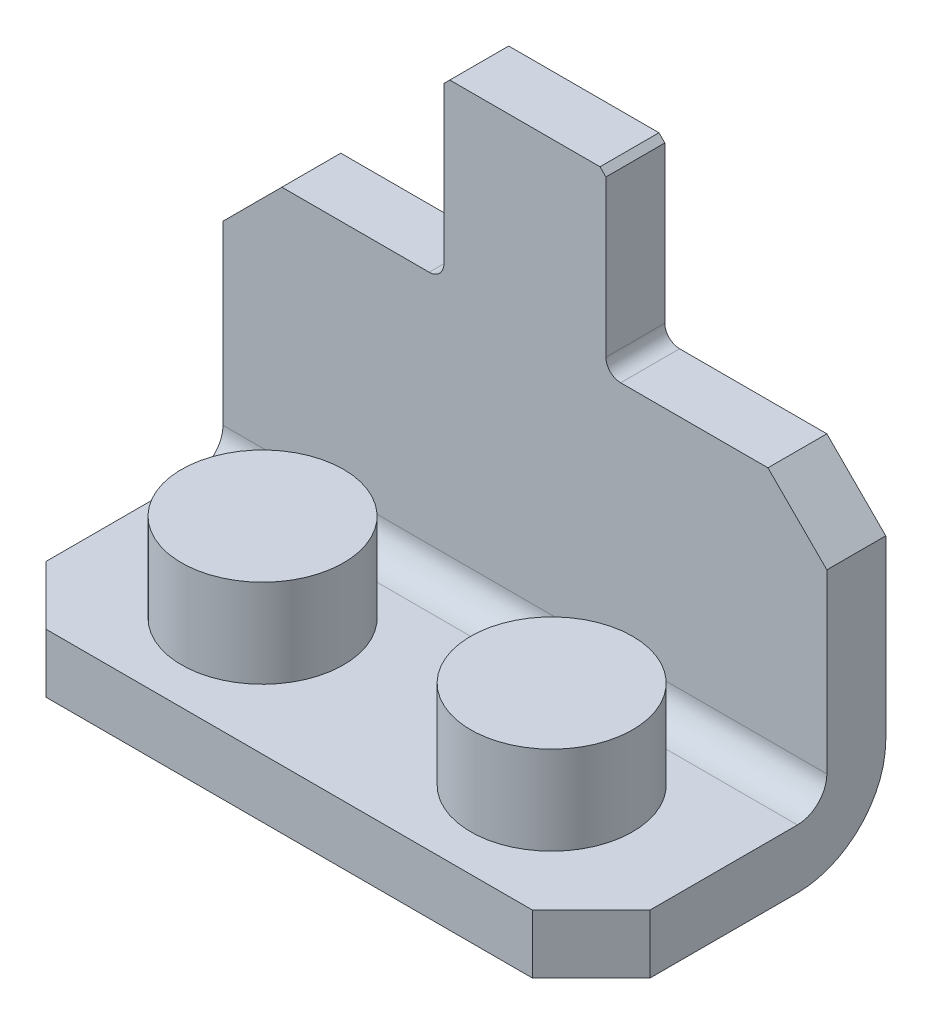
ISO-10303-21;
HEADER;
FILE_DESCRIPTION(('STEP AP214'),'2;1');
FILE_NAME('part.step','',(''),(''),'','','');
FILE_SCHEMA(('AUTOMOTIVE_DESIGN { 1 0 10303 214 1 1 1 1 }'));
ENDSEC;
DATA;
#1=APPLICATION_CONTEXT('core data for automotive mechanical design processes');
#2=APPLICATION_PROTOCOL_DEFINITION('international standard','automotive_design',2000,#1);
#3=PRODUCT_CONTEXT('',#1,'mechanical');
#4=PRODUCT('Part','Part','',(#3));
#5=PRODUCT_RELATED_PRODUCT_CATEGORY('part','',(#4));
#6=PRODUCT_DEFINITION_FORMATION('','',#4);
#7=PRODUCT_DEFINITION_CONTEXT('part definition',#1,'design');
#8=PRODUCT_DEFINITION('design','',#6,#7);
#9=PRODUCT_DEFINITION_SHAPE('','',#8);
#10=(LENGTH_UNIT() NAMED_UNIT(*) SI_UNIT(.MILLI.,.METRE.));
#11=(NAMED_UNIT(*) PLANE_ANGLE_UNIT() SI_UNIT($,.RADIAN.));
#12=(NAMED_UNIT(*) SI_UNIT($,.STERADIAN.) SOLID_ANGLE_UNIT());
#13=UNCERTAINTY_MEASURE_WITH_UNIT(LENGTH_MEASURE(1.E-05),#10,'distance_accuracy_value','');
#14=(GEOMETRIC_REPRESENTATION_CONTEXT(3) GLOBAL_UNCERTAINTY_ASSIGNED_CONTEXT((#13)) GLOBAL_UNIT_ASSIGNED_CONTEXT((#10,
#11,#12)) REPRESENTATION_CONTEXT('',''));
#15=CARTESIAN_POINT('',(0.,0.,0.));
#16=DIRECTION('',(0.,0.,1.));
#17=DIRECTION('',(1.,0.,0.));
#18=AXIS2_PLACEMENT_3D('',#15,#16,#17);
#19=CARTESIAN_POINT('',(4.90718107860033,2.,3.));
#20=DIRECTION('',(0.,1.,0.));
#21=DIRECTION('',(0.,0.,1.));
#22=AXIS2_PLACEMENT_3D('',#19,#20,#21);
#23=PLANE('',#22);
#24=CARTESIAN_POINT('',(4.90718107860033,2.,3.));
#25=DIRECTION('',(0.,1.,0.));
#26=DIRECTION('',(0.,0.,1.));
#27=AXIS2_PLACEMENT_3D('',#24,#25,#26);
#28=CIRCLE('',#27,1.65);
#29=CARTESIAN_POINT('',(4.90718107860033,2.,4.65));
#30=VERTEX_POINT('',#29);
#31=EDGE_CURVE('E20',#30,#30,#28,.F.);
#32=ORIENTED_EDGE('',*,*,#31,.T.);
#33=EDGE_LOOP('',(#32));
#34=FACE_BOUND('',#33,.T.);
#35=ADVANCED_FACE('F17',(#34),#23,.F.);
#36=CARTESIAN_POINT('',(-4.9071810785995,2.,3.));
#37=DIRECTION('',(0.,1.,0.));
#38=DIRECTION('',(0.,0.,1.));
#39=AXIS2_PLACEMENT_3D('',#36,#37,#38);
#40=PLANE('',#39);
#41=CARTESIAN_POINT('',(-4.9071810785995,2.,3.));
#42=DIRECTION('',(0.,1.,0.));
#43=DIRECTION('',(0.,0.,1.));
#44=AXIS2_PLACEMENT_3D('',#41,#42,#43);
#45=CIRCLE('',#44,1.65);
#46=CARTESIAN_POINT('',(-4.9071810785995,2.,4.65));
#47=VERTEX_POINT('',#46);
#48=EDGE_CURVE('E397',#47,#47,#45,.F.);
#49=ORIENTED_EDGE('',*,*,#48,.T.);
#50=EDGE_LOOP('',(#49));
#51=FACE_BOUND('',#50,.T.);
#52=ADVANCED_FACE('F408',(#51),#40,.F.);
#53=CARTESIAN_POINT('',(4.90718107860033,0.,3.));
#54=DIRECTION('',(0.,1.,0.));
#55=DIRECTION('',(0.,0.,1.));
#56=AXIS2_PLACEMENT_3D('',#53,#54,#55);
#57=CYLINDRICAL_SURFACE('',#56,1.65);
#58=CARTESIAN_POINT('',(4.90718107860033,0.,3.));
#59=DIRECTION('',(0.,1.,0.));
#60=DIRECTION('',(0.,0.,1.));
#61=AXIS2_PLACEMENT_3D('',#58,#59,#60);
#62=CIRCLE('',#61,1.65);
#63=CARTESIAN_POINT('',(4.90718107860033,0.,4.65));
#64=VERTEX_POINT('',#63);
#65=EDGE_CURVE('E395',#64,#64,#62,.F.);
#66=ORIENTED_EDGE('',*,*,#65,.T.);
#67=EDGE_LOOP('',(#66));
#68=FACE_BOUND('',#67,.T.);
#69=ORIENTED_EDGE('',*,*,#31,.F.);
#70=EDGE_LOOP('',(#69));
#71=FACE_BOUND('',#70,.T.);
#72=ADVANCED_FACE('F405',(#68,#71),#57,.F.);
#73=CARTESIAN_POINT('',(-4.9071810785995,0.,3.));
#74=DIRECTION('',(0.,1.,0.));
#75=DIRECTION('',(0.,0.,1.));
#76=AXIS2_PLACEMENT_3D('',#73,#74,#75);
#77=CYLINDRICAL_SURFACE('',#76,1.65);
#78=CARTESIAN_POINT('',(-4.9071810785995,0.,3.));
#79=DIRECTION('',(0.,1.,0.));
#80=DIRECTION('',(0.,0.,1.));
#81=AXIS2_PLACEMENT_3D('',#78,#79,#80);
#82=CIRCLE('',#81,1.65);
#83=CARTESIAN_POINT('',(-4.9071810785995,0.,4.65));
#84=VERTEX_POINT('',#83);
#85=EDGE_CURVE('E392',#84,#84,#82,.F.);
#86=ORIENTED_EDGE('',*,*,#85,.T.);
#87=EDGE_LOOP('',(#86));
#88=FACE_BOUND('',#87,.T.);
#89=ORIENTED_EDGE('',*,*,#48,.F.);
#90=EDGE_LOOP('',(#89));
#91=FACE_BOUND('',#90,.T.);
#92=ADVANCED_FACE('F407',(#88,#91),#77,.F.);
#93=CARTESIAN_POINT('',(-4.9071810785995,5.,3.));
#94=DIRECTION('',(0.,1.,0.));
#95=DIRECTION('',(0.,0.,1.));
#96=AXIS2_PLACEMENT_3D('',#93,#94,#95);
#97=PLANE('',#96);
#98=CARTESIAN_POINT('',(-4.9071810785995,5.,3.));
#99=DIRECTION('',(0.,-1.,0.));
#100=DIRECTION('',(0.,0.,-1.));
#101=AXIS2_PLACEMENT_3D('',#98,#99,#100);
#102=CIRCLE('',#101,2.75);
#103=CARTESIAN_POINT('',(-4.9071810785995,5.,0.25));
#104=VERTEX_POINT('',#103);
#105=EDGE_CURVE('E364',#104,#104,#102,.T.);
#106=ORIENTED_EDGE('',*,*,#105,.F.);
#107=EDGE_LOOP('',(#106));
#108=FACE_BOUND('',#107,.T.);
#109=ADVANCED_FACE('F417',(#108),#97,.T.);
#110=CARTESIAN_POINT('',(4.90718107860033,5.,3.));
#111=DIRECTION('',(0.,1.,0.));
#112=DIRECTION('',(0.,0.,1.));
#113=AXIS2_PLACEMENT_3D('',#110,#111,#112);
#114=PLANE('',#113);
#115=CARTESIAN_POINT('',(4.90718107860033,5.,3.));
#116=DIRECTION('',(0.,-1.,0.));
#117=DIRECTION('',(0.,0.,-1.));
#118=AXIS2_PLACEMENT_3D('',#115,#116,#117);
#119=CIRCLE('',#118,2.75);
#120=CARTESIAN_POINT('',(4.90718107860033,5.,0.25));
#121=VERTEX_POINT('',#120);
#122=EDGE_CURVE('E316',#121,#121,#119,.T.);
#123=ORIENTED_EDGE('',*,*,#122,.F.);
#124=EDGE_LOOP('',(#123));
#125=FACE_BOUND('',#124,.T.);
#126=ADVANCED_FACE('F512',(#125),#114,.T.);
#127=CARTESIAN_POINT('',(2.75,0.,-17.14));
#128=DIRECTION('',(0.,1.,0.));
#129=DIRECTION('',(0.,0.,1.));
#130=AXIS2_PLACEMENT_3D('',#127,#128,#129);
#131=PLANE('',#130);
#132=DIRECTION('',(-0.707106781186549,0.,0.707106781186546));
#133=VECTOR('',#132,1.);
#134=CARTESIAN_POINT('',(10.25,0.,5.));
#135=LINE('',#134,#133);
#136=CARTESIAN_POINT('',(10.25,0.,5.));
#137=VERTEX_POINT('',#136);
#138=CARTESIAN_POINT('',(8.25,0.,7.));
#139=VERTEX_POINT('',#138);
#140=EDGE_CURVE('E332',#137,#139,#135,.T.);
#141=ORIENTED_EDGE('',*,*,#140,.T.);
#142=DIRECTION('',(-1.,0.,0.));
#143=VECTOR('',#142,1.);
#144=CARTESIAN_POINT('',(-10.25,0.,7.));
#145=LINE('',#144,#143);
#146=CARTESIAN_POINT('',(-8.25,0.,7.));
#147=VERTEX_POINT('',#146);
#148=EDGE_CURVE('E360',#139,#147,#145,.T.);
#149=ORIENTED_EDGE('',*,*,#148,.T.);
#150=DIRECTION('',(-0.707106781186546,0.,-0.707106781186549));
#151=VECTOR('',#150,1.);
#152=CARTESIAN_POINT('',(-8.25,0.,7.));
#153=LINE('',#152,#151);
#154=CARTESIAN_POINT('',(-10.25,0.,5.));
#155=VERTEX_POINT('',#154);
#156=EDGE_CURVE('E343',#147,#155,#153,.T.);
#157=ORIENTED_EDGE('',*,*,#156,.T.);
#158=DIRECTION('',(0.,0.,-1.));
#159=VECTOR('',#158,1.);
#160=CARTESIAN_POINT('',(-10.25,0.,-11.14));
#161=LINE('',#160,#159);
#162=CARTESIAN_POINT('',(-10.25,2.78639958328774E-13,0.000796326794900833));
#163=VERTEX_POINT('',#162);
#164=EDGE_CURVE('E331',#155,#163,#161,.T.);
#165=ORIENTED_EDGE('',*,*,#164,.T.);
#166=DIRECTION('',(-1.,0.,0.));
#167=VECTOR('',#166,1.);
#168=CARTESIAN_POINT('',(20.8355370557394,5.57279916657549E-13,0.000796326794899676));
#169=LINE('',#168,#167);
#170=CARTESIAN_POINT('',(10.25,2.78639958328774E-13,0.000796326794900558));
#171=VERTEX_POINT('',#170);
#172=EDGE_CURVE('E163',#171,#163,#169,.T.);
#173=ORIENTED_EDGE('',*,*,#172,.F.);
#174=DIRECTION('',(0.,0.,1.));
#175=VECTOR('',#174,1.);
#176=CARTESIAN_POINT('',(10.25,0.,7.));
#177=LINE('',#176,#175);
#178=EDGE_CURVE('E313',#171,#137,#177,.T.);
#179=ORIENTED_EDGE('',*,*,#178,.T.);
#180=EDGE_LOOP('',(#141,#149,#157,#165,#173,#179));
#181=FACE_BOUND('',#180,.T.);
#182=ORIENTED_EDGE('',*,*,#85,.F.);
#183=EDGE_LOOP('',(#182));
#184=FACE_BOUND('',#183,.T.);
#185=ORIENTED_EDGE('',*,*,#65,.F.);
#186=EDGE_LOOP('',(#185));
#187=FACE_BOUND('',#186,.T.);
#188=ADVANCED_FACE('F508',(#181,#184,#187),#131,.F.);
#189=CARTESIAN_POINT('',(-4.9071810785995,5.,3.));
#190=DIRECTION('',(0.,-1.,0.));
#191=DIRECTION('',(0.,0.,-1.));
#192=AXIS2_PLACEMENT_3D('',#189,#190,#191);
#193=CYLINDRICAL_SURFACE('',#192,2.75);
#194=CARTESIAN_POINT('',(-4.9071810785995,2.,3.));
#195=DIRECTION('',(0.,-1.,0.));
#196=DIRECTION('',(0.,0.,-1.));
#197=AXIS2_PLACEMENT_3D('',#194,#195,#196);
#198=CIRCLE('',#197,2.75);
#199=CARTESIAN_POINT('',(-4.9071810785995,2.,0.25));
#200=VERTEX_POINT('',#199);
#201=EDGE_CURVE('E337',#200,#200,#198,.T.);
#202=ORIENTED_EDGE('',*,*,#201,.F.);
#203=EDGE_LOOP('',(#202));
#204=FACE_BOUND('',#203,.T.);
#205=ORIENTED_EDGE('',*,*,#105,.T.);
#206=EDGE_LOOP('',(#205));
#207=FACE_BOUND('',#206,.T.);
#208=ADVANCED_FACE('F504',(#204,#207),#193,.T.);
#209=CARTESIAN_POINT('',(-10.25,2.,7.));
#210=DIRECTION('',(0.,0.,-1.));
#211=DIRECTION('',(-1.,0.,0.));
#212=AXIS2_PLACEMENT_3D('',#209,#210,#211);
#213=PLANE('',#212);
#214=DIRECTION('',(0.,1.,0.));
#215=VECTOR('',#214,1.);
#216=CARTESIAN_POINT('',(8.25,2.,7.));
#217=LINE('',#216,#215);
#218=CARTESIAN_POINT('',(8.25,2.,7.));
#219=VERTEX_POINT('',#218);
#220=EDGE_CURVE('E329',#139,#219,#217,.T.);
#221=ORIENTED_EDGE('',*,*,#220,.T.);
#222=DIRECTION('',(1.,0.,0.));
#223=VECTOR('',#222,1.);
#224=CARTESIAN_POINT('',(2.75,2.,7.));
#225=LINE('',#224,#223);
#226=CARTESIAN_POINT('',(-8.25,2.,7.));
#227=VERTEX_POINT('',#226);
#228=EDGE_CURVE('E326',#227,#219,#225,.T.);
#229=ORIENTED_EDGE('',*,*,#228,.F.);
#230=DIRECTION('',(0.,1.,0.));
#231=VECTOR('',#230,1.);
#232=CARTESIAN_POINT('',(-8.25,2.,7.));
#233=LINE('',#232,#231);
#234=EDGE_CURVE('E340',#227,#147,#233,.F.);
#235=ORIENTED_EDGE('',*,*,#234,.T.);
#236=ORIENTED_EDGE('',*,*,#148,.F.);
#237=EDGE_LOOP('',(#221,#229,#235,#236));
#238=FACE_BOUND('',#237,.T.);
#239=ADVANCED_FACE('F500',(#238),#213,.F.);
#240=CARTESIAN_POINT('',(10.25,2.,5.));
#241=DIRECTION('',(-0.707106781186546,0.,-0.707106781186549));
#242=DIRECTION('',(-0.707106781186549,0.,0.707106781186546));
#243=AXIS2_PLACEMENT_3D('',#240,#241,#242);
#244=PLANE('',#243);
#245=ORIENTED_EDGE('',*,*,#220,.F.);
#246=ORIENTED_EDGE('',*,*,#140,.F.);
#247=DIRECTION('',(0.,1.,0.));
#248=VECTOR('',#247,1.);
#249=CARTESIAN_POINT('',(10.25,2.,5.));
#250=LINE('',#249,#248);
#251=CARTESIAN_POINT('',(10.25,2.,5.));
#252=VERTEX_POINT('',#251);
#253=EDGE_CURVE('E315',#137,#252,#250,.T.);
#254=ORIENTED_EDGE('',*,*,#253,.T.);
#255=DIRECTION('',(0.707106781186549,0.,-0.707106781186546));
#256=VECTOR('',#255,1.);
#257=CARTESIAN_POINT('',(8.25,2.,7.));
#258=LINE('',#257,#256);
#259=EDGE_CURVE('E256',#219,#252,#258,.T.);
#260=ORIENTED_EDGE('',*,*,#259,.F.);
#261=EDGE_LOOP('',(#245,#246,#254,#260));
#262=FACE_BOUND('',#261,.T.);
#263=ADVANCED_FACE('F496',(#262),#244,.F.);
#264=CARTESIAN_POINT('',(-8.25,2.,7.));
#265=DIRECTION('',(0.707106781186549,0.,-0.707106781186546));
#266=DIRECTION('',(-0.707106781186546,0.,-0.707106781186549));
#267=AXIS2_PLACEMENT_3D('',#264,#265,#266);
#268=PLANE('',#267);
#269=DIRECTION('',(0.,1.,0.));
#270=VECTOR('',#269,1.);
#271=CARTESIAN_POINT('',(-10.25,2.,5.));
#272=LINE('',#271,#270);
#273=CARTESIAN_POINT('',(-10.25,2.00000000000028,5.));
#274=VERTEX_POINT('',#273);
#275=EDGE_CURVE('E368',#155,#274,#272,.T.);
#276=ORIENTED_EDGE('',*,*,#275,.F.);
#277=ORIENTED_EDGE('',*,*,#156,.F.);
#278=ORIENTED_EDGE('',*,*,#234,.F.);
#279=DIRECTION('',(0.707106781186545,0.,0.70710678118655));
#280=VECTOR('',#279,1.);
#281=CARTESIAN_POINT('',(-10.25,2.,5.));
#282=LINE('',#281,#280);
#283=EDGE_CURVE('E346',#274,#227,#282,.T.);
#284=ORIENTED_EDGE('',*,*,#283,.F.);
#285=EDGE_LOOP('',(#276,#277,#278,#284));
#286=FACE_BOUND('',#285,.T.);
#287=ADVANCED_FACE('F492',(#286),#268,.F.);
#288=CARTESIAN_POINT('',(4.90718107860033,5.,3.));
#289=DIRECTION('',(0.,-1.,0.));
#290=DIRECTION('',(0.,0.,-1.));
#291=AXIS2_PLACEMENT_3D('',#288,#289,#290);
#292=CYLINDRICAL_SURFACE('',#291,2.75);
#293=CARTESIAN_POINT('',(4.90718107860033,2.,3.));
#294=DIRECTION('',(0.,-1.,0.));
#295=DIRECTION('',(0.,0.,-1.));
#296=AXIS2_PLACEMENT_3D('',#293,#294,#295);
#297=CIRCLE('',#296,2.75);
#298=CARTESIAN_POINT('',(4.90718107860033,2.,0.25));
#299=VERTEX_POINT('',#298);
#300=EDGE_CURVE('E349',#299,#299,#297,.T.);
#301=ORIENTED_EDGE('',*,*,#300,.F.);
#302=EDGE_LOOP('',(#301));
#303=FACE_BOUND('',#302,.T.);
#304=ORIENTED_EDGE('',*,*,#122,.T.);
#305=EDGE_LOOP('',(#304));
#306=FACE_BOUND('',#305,.T.);
#307=ADVANCED_FACE('F488',(#303,#306),#292,.T.);
#308=CARTESIAN_POINT('',(20.8355370557394,3.,0.000796326794900227));
#309=DIRECTION('',(-1.,0.,0.));
#310=DIRECTION('',(0.,0.,1.));
#311=AXIS2_PLACEMENT_3D('',#308,#309,#310);
#312=CYLINDRICAL_SURFACE('',#311,2.99999999999944);
#313=ORIENTED_EDGE('',*,*,#172,.T.);
#314=CARTESIAN_POINT('',(-10.25,3.,0.000796326794901542));
#315=DIRECTION('',(-1.,0.,0.));
#316=DIRECTION('',(0.,0.,1.));
#317=AXIS2_PLACEMENT_3D('',#314,#315,#316);
#318=CIRCLE('',#317,2.99999999999944);
#319=CARTESIAN_POINT('',(-10.25,3.,-2.99920367320482));
#320=VERTEX_POINT('',#319);
#321=EDGE_CURVE('E383',#163,#320,#318,.F.);
#322=ORIENTED_EDGE('',*,*,#321,.T.);
#323=DIRECTION('',(1.,0.,0.));
#324=VECTOR('',#323,1.);
#325=CARTESIAN_POINT('',(2.75,3.,-2.9992036732051));
#326=LINE('',#325,#324);
#327=CARTESIAN_POINT('',(10.25,3.,-2.99920367320482));
#328=VERTEX_POINT('',#327);
#329=EDGE_CURVE('E245',#320,#328,#326,.T.);
#330=ORIENTED_EDGE('',*,*,#329,.T.);
#331=CARTESIAN_POINT('',(10.25,3.,0.000796326794900675));
#332=DIRECTION('',(-1.,0.,0.));
#333=DIRECTION('',(0.,0.,1.));
#334=AXIS2_PLACEMENT_3D('',#331,#332,#333);
#335=CIRCLE('',#334,2.99999999999944);
#336=EDGE_CURVE('E284',#328,#171,#335,.T.);
#337=ORIENTED_EDGE('',*,*,#336,.T.);
#338=EDGE_LOOP('',(#313,#322,#330,#337));
#339=FACE_BOUND('',#338,.T.);
#340=ADVANCED_FACE('F485',(#339),#312,.T.);
#341=CARTESIAN_POINT('',(3.25,11.4992036732051,-0.999203673205072));
#342=DIRECTION('',(0.,0.,1.));
#343=DIRECTION('',(0.,-1.,0.));
#344=AXIS2_PLACEMENT_3D('',#341,#342,#343);
#345=CYLINDRICAL_SURFACE('',#344,0.5);
#346=DIRECTION('',(0.,0.,-1.));
#347=VECTOR('',#346,1.);
#348=CARTESIAN_POINT('',(3.25,10.9992036732051,-0.999203673205073));
#349=LINE('',#348,#347);
#350=CARTESIAN_POINT('',(3.25,10.9992036732051,-0.999203673205073));
#351=VERTEX_POINT('',#350);
#352=CARTESIAN_POINT('',(3.25,10.9992036732051,-2.99920367320508));
#353=VERTEX_POINT('',#352);
#354=EDGE_CURVE('E225',#351,#353,#349,.T.);
#355=ORIENTED_EDGE('',*,*,#354,.T.);
#356=CARTESIAN_POINT('',(3.25,11.4992036732051,-2.99920367320507));
#357=DIRECTION('',(0.,0.,1.));
#358=DIRECTION('',(0.,-1.,0.));
#359=AXIS2_PLACEMENT_3D('',#356,#357,#358);
#360=CIRCLE('',#359,0.5);
#361=CARTESIAN_POINT('',(2.75,11.4992036732051,-2.99920367320507));
#362=VERTEX_POINT('',#361);
#363=EDGE_CURVE('E169',#353,#362,#360,.F.);
#364=ORIENTED_EDGE('',*,*,#363,.T.);
#365=DIRECTION('',(0.,0.,1.));
#366=VECTOR('',#365,1.);
#367=CARTESIAN_POINT('',(2.75,11.4992036732051,-0.999203673205073));
#368=LINE('',#367,#366);
#369=CARTESIAN_POINT('',(2.75,11.4992036732051,-0.999203673205072));
#370=VERTEX_POINT('',#369);
#371=EDGE_CURVE('E166',#362,#370,#368,.T.);
#372=ORIENTED_EDGE('',*,*,#371,.T.);
#373=CARTESIAN_POINT('',(3.25,11.4992036732051,-0.999203673205072));
#374=DIRECTION('',(0.,0.,1.));
#375=DIRECTION('',(0.,-1.,0.));
#376=AXIS2_PLACEMENT_3D('',#373,#374,#375);
#377=CIRCLE('',#376,0.5);
#378=EDGE_CURVE('E152',#351,#370,#377,.F.);
#379=ORIENTED_EDGE('',*,*,#378,.F.);
#380=EDGE_LOOP('',(#355,#364,#372,#379));
#381=FACE_BOUND('',#380,.T.);
#382=ADVANCED_FACE('F167',(#381),#345,.F.);
#383=CARTESIAN_POINT('',(2.55,16.9992036732051,-0.999203673205053));
#384=DIRECTION('',(-0.707106781186546,-0.707106781186549,0.));
#385=DIRECTION('',(0.707106781186549,-0.707106781186546,0.));
#386=AXIS2_PLACEMENT_3D('',#383,#384,#385);
#387=PLANE('',#386);
#388=DIRECTION('',(0.,0.,1.));
#389=VECTOR('',#388,1.);
#390=CARTESIAN_POINT('',(2.75,16.7992036732051,-0.999203673205073));
#391=LINE('',#390,#389);
#392=CARTESIAN_POINT('',(2.75,16.7992036732051,-0.999203673205053));
#393=VERTEX_POINT('',#392);
#394=CARTESIAN_POINT('',(2.75,16.7992036732051,-2.99920367320506));
#395=VERTEX_POINT('',#394);
#396=EDGE_CURVE('E178',#393,#395,#391,.F.);
#397=ORIENTED_EDGE('',*,*,#396,.T.);
#398=DIRECTION('',(-0.707106781186558,0.707106781186538,0.));
#399=VECTOR('',#398,1.);
#400=CARTESIAN_POINT('',(2.75,16.7992036732051,-2.99920367320506));
#401=LINE('',#400,#399);
#402=CARTESIAN_POINT('',(2.55,16.9992036732051,-2.99920367320506));
#403=VERTEX_POINT('',#402);
#404=EDGE_CURVE('E227',#395,#403,#401,.T.);
#405=ORIENTED_EDGE('',*,*,#404,.T.);
#406=DIRECTION('',(0.,0.,-1.));
#407=VECTOR('',#406,1.);
#408=CARTESIAN_POINT('',(2.55,16.9992036732051,-0.999203673205053));
#409=LINE('',#408,#407);
#410=CARTESIAN_POINT('',(2.55,16.9992036732051,-0.999203673205053));
#411=VERTEX_POINT('',#410);
#412=EDGE_CURVE('E218',#403,#411,#409,.F.);
#413=ORIENTED_EDGE('',*,*,#412,.T.);
#414=DIRECTION('',(0.707106781186549,-0.707106781186546,0.));
#415=VECTOR('',#414,1.);
#416=CARTESIAN_POINT('',(2.55,16.9992036732051,-0.999203673205053));
#417=LINE('',#416,#415);
#418=EDGE_CURVE('E162',#393,#411,#417,.F.);
#419=ORIENTED_EDGE('',*,*,#418,.F.);
#420=EDGE_LOOP('',(#397,#405,#413,#419));
#421=FACE_BOUND('',#420,.T.);
#422=ADVANCED_FACE('F478',(#421),#387,.F.);
#423=CARTESIAN_POINT('',(-2.75,16.7992036732051,-0.999203673205053));
#424=DIRECTION('',(0.707106781186548,-0.707106781186548,0.));
#425=DIRECTION('',(0.707106781186548,0.707106781186548,0.));
#426=AXIS2_PLACEMENT_3D('',#423,#424,#425);
#427=PLANE('',#426);
#428=DIRECTION('',(0.,0.,-1.));
#429=VECTOR('',#428,1.);
#430=CARTESIAN_POINT('',(-2.55,16.9992036732051,-0.999203673205053));
#431=LINE('',#430,#429);
#432=CARTESIAN_POINT('',(-2.55,16.9992036732051,-0.999203673205053));
#433=VERTEX_POINT('',#432);
#434=CARTESIAN_POINT('',(-2.55,16.9992036732051,-2.99920367320505));
#435=VERTEX_POINT('',#434);
#436=EDGE_CURVE('E173',#433,#435,#431,.T.);
#437=ORIENTED_EDGE('',*,*,#436,.T.);
#438=DIRECTION('',(-0.707106781186554,-0.707106781186542,0.));
#439=VECTOR('',#438,1.);
#440=CARTESIAN_POINT('',(-2.55,16.9992036732051,-2.99920367320505));
#441=LINE('',#440,#439);
#442=CARTESIAN_POINT('',(-2.75,16.7992036732051,-2.99920367320507));
#443=VERTEX_POINT('',#442);
#444=EDGE_CURVE('E282',#435,#443,#441,.T.);
#445=ORIENTED_EDGE('',*,*,#444,.T.);
#446=DIRECTION('',(0.,0.,1.));
#447=VECTOR('',#446,1.);
#448=CARTESIAN_POINT('',(-2.75,16.7992036732051,-0.999203673205053));
#449=LINE('',#448,#447);
#450=CARTESIAN_POINT('',(-2.75,16.7992036732051,-0.999203673205053));
#451=VERTEX_POINT('',#450);
#452=EDGE_CURVE('E215',#443,#451,#449,.T.);
#453=ORIENTED_EDGE('',*,*,#452,.T.);
#454=DIRECTION('',(0.707106781186548,0.707106781186548,0.));
#455=VECTOR('',#454,1.);
#456=CARTESIAN_POINT('',(-2.75,16.7992036732051,-0.999203673205053));
#457=LINE('',#456,#455);
#458=EDGE_CURVE('E287',#433,#451,#457,.F.);
#459=ORIENTED_EDGE('',*,*,#458,.F.);
#460=EDGE_LOOP('',(#437,#445,#453,#459));
#461=FACE_BOUND('',#460,.T.);
#462=ADVANCED_FACE('F474',(#461),#427,.F.);
#463=CARTESIAN_POINT('',(-3.25,11.4992036732051,-0.999203673205072));
#464=DIRECTION('',(0.,0.,1.));
#465=DIRECTION('',(0.,-1.,0.));
#466=AXIS2_PLACEMENT_3D('',#463,#464,#465);
#467=CYLINDRICAL_SURFACE('',#466,0.5);
#468=DIRECTION('',(0.,0.,1.));
#469=VECTOR('',#468,1.);
#470=CARTESIAN_POINT('',(-2.75,11.4992036732051,-0.999203673205053));
#471=LINE('',#470,#469);
#472=CARTESIAN_POINT('',(-2.75,11.4992036732051,-0.999203673205072));
#473=VERTEX_POINT('',#472);
#474=CARTESIAN_POINT('',(-2.75,11.4992036732051,-2.99920367320507));
#475=VERTEX_POINT('',#474);
#476=EDGE_CURVE('E212',#473,#475,#471,.F.);
#477=ORIENTED_EDGE('',*,*,#476,.T.);
#478=CARTESIAN_POINT('',(-3.25,11.4992036732051,-2.99920367320507));
#479=DIRECTION('',(0.,0.,1.));
#480=DIRECTION('',(0.,-1.,0.));
#481=AXIS2_PLACEMENT_3D('',#478,#479,#480);
#482=CIRCLE('',#481,0.5);
#483=CARTESIAN_POINT('',(-3.25,10.9992036732051,-2.99920367320508));
#484=VERTEX_POINT('',#483);
#485=EDGE_CURVE('E247',#475,#484,#482,.F.);
#486=ORIENTED_EDGE('',*,*,#485,.T.);
#487=DIRECTION('',(0.,0.,-1.));
#488=VECTOR('',#487,1.);
#489=CARTESIAN_POINT('',(-3.25,10.9992036732051,-0.999203673205073));
#490=LINE('',#489,#488);
#491=CARTESIAN_POINT('',(-3.25,10.9992036732051,-0.999203673205073));
#492=VERTEX_POINT('',#491);
#493=EDGE_CURVE('E195',#484,#492,#490,.F.);
#494=ORIENTED_EDGE('',*,*,#493,.T.);
#495=CARTESIAN_POINT('',(-3.25,11.4992036732051,-0.999203673205072));
#496=DIRECTION('',(0.,0.,1.));
#497=DIRECTION('',(0.,-1.,0.));
#498=AXIS2_PLACEMENT_3D('',#495,#496,#497);
#499=CIRCLE('',#498,0.5);
#500=EDGE_CURVE('E289',#473,#492,#499,.F.);
#501=ORIENTED_EDGE('',*,*,#500,.F.);
#502=EDGE_LOOP('',(#477,#486,#494,#501));
#503=FACE_BOUND('',#502,.T.);
#504=ADVANCED_FACE('F470',(#503),#467,.F.);
#505=CARTESIAN_POINT('',(2.75,2.,-17.14));
#506=DIRECTION('',(0.,1.,0.));
#507=DIRECTION('',(0.,0.,1.));
#508=AXIS2_PLACEMENT_3D('',#505,#506,#507);
#509=PLANE('',#508);
#510=ORIENTED_EDGE('',*,*,#300,.T.);
#511=EDGE_LOOP('',(#510));
#512=FACE_BOUND('',#511,.T.);
#513=DIRECTION('',(0.,0.,1.));
#514=VECTOR('',#513,1.);
#515=CARTESIAN_POINT('',(-10.25,2.,-17.14));
#516=LINE('',#515,#514);
#517=CARTESIAN_POINT('',(-10.25,2.00000000000028,0.000796326794900481));
#518=VERTEX_POINT('',#517);
#519=EDGE_CURVE('E255',#518,#274,#516,.T.);
#520=ORIENTED_EDGE('',*,*,#519,.T.);
#521=ORIENTED_EDGE('',*,*,#283,.T.);
#522=ORIENTED_EDGE('',*,*,#228,.T.);
#523=ORIENTED_EDGE('',*,*,#259,.T.);
#524=DIRECTION('',(0.,0.,1.));
#525=VECTOR('',#524,1.);
#526=CARTESIAN_POINT('',(10.25,2.,-17.14));
#527=LINE('',#526,#525);
#528=CARTESIAN_POINT('',(10.25,2.00000000000028,0.000796326794899695));
#529=VERTEX_POINT('',#528);
#530=EDGE_CURVE('E252',#252,#529,#527,.F.);
#531=ORIENTED_EDGE('',*,*,#530,.T.);
#532=DIRECTION('',(-1.,0.,0.));
#533=VECTOR('',#532,1.);
#534=CARTESIAN_POINT('',(20.8355370557394,2.00000000000056,0.000796326794898267));
#535=LINE('',#534,#533);
#536=EDGE_CURVE('E244',#529,#518,#535,.T.);
#537=ORIENTED_EDGE('',*,*,#536,.T.);
#538=EDGE_LOOP('',(#520,#521,#522,#523,#531,#537));
#539=FACE_BOUND('',#538,.T.);
#540=ORIENTED_EDGE('',*,*,#201,.T.);
#541=EDGE_LOOP('',(#540));
#542=FACE_BOUND('',#541,.T.);
#543=ADVANCED_FACE('F466',(#512,#539,#542),#509,.T.);
#544=CARTESIAN_POINT('',(2.75,16.9992036732051,-2.99920367320506));
#545=DIRECTION('',(0.,0.,1.));
#546=DIRECTION('',(0.,-1.,0.));
#547=AXIS2_PLACEMENT_3D('',#544,#545,#546);
#548=PLANE('',#547);
#549=ORIENTED_EDGE('',*,*,#404,.F.);
#550=DIRECTION('',(0.,1.,0.));
#551=VECTOR('',#550,1.);
#552=CARTESIAN_POINT('',(2.75,10.9992036732051,-2.99920367320506));
#553=LINE('',#552,#551);
#554=EDGE_CURVE('E174',#395,#362,#553,.F.);
#555=ORIENTED_EDGE('',*,*,#554,.T.);
#556=ORIENTED_EDGE('',*,*,#363,.F.);
#557=DIRECTION('',(1.,0.,0.));
#558=VECTOR('',#557,1.);
#559=CARTESIAN_POINT('',(2.75,10.9992036732051,-2.99920367320508));
#560=LINE('',#559,#558);
#561=CARTESIAN_POINT('',(8.25,10.9992036732051,-2.99920367320508));
#562=VERTEX_POINT('',#561);
#563=EDGE_CURVE('E222',#353,#562,#560,.T.);
#564=ORIENTED_EDGE('',*,*,#563,.T.);
#565=DIRECTION('',(0.707106781186546,-0.707106781186549,0.));
#566=VECTOR('',#565,1.);
#567=CARTESIAN_POINT('',(8.25,10.9992036732051,-2.99920367320508));
#568=LINE('',#567,#566);
#569=CARTESIAN_POINT('',(10.25,8.9992036732051,-2.99920367320508));
#570=VERTEX_POINT('',#569);
#571=EDGE_CURVE('E194',#562,#570,#568,.T.);
#572=ORIENTED_EDGE('',*,*,#571,.T.);
#573=DIRECTION('',(0.,1.,0.));
#574=VECTOR('',#573,1.);
#575=CARTESIAN_POINT('',(10.25,-7.1407963267949,-2.99920367320508));
#576=LINE('',#575,#574);
#577=EDGE_CURVE('E231',#570,#328,#576,.F.);
#578=ORIENTED_EDGE('',*,*,#577,.T.);
#579=ORIENTED_EDGE('',*,*,#329,.F.);
#580=DIRECTION('',(0.,1.,0.));
#581=VECTOR('',#580,1.);
#582=CARTESIAN_POINT('',(-10.25,10.9992036732051,-2.9992036732051));
#583=LINE('',#582,#581);
#584=CARTESIAN_POINT('',(-10.25,8.9992036732051,-2.99920367320509));
#585=VERTEX_POINT('',#584);
#586=EDGE_CURVE('E209',#320,#585,#583,.T.);
#587=ORIENTED_EDGE('',*,*,#586,.T.);
#588=DIRECTION('',(0.707106781186549,0.707106781186546,0.));
#589=VECTOR('',#588,1.);
#590=CARTESIAN_POINT('',(-10.25,8.9992036732051,-2.99920367320508));
#591=LINE('',#590,#589);
#592=CARTESIAN_POINT('',(-8.25,10.9992036732051,-2.99920367320508));
#593=VERTEX_POINT('',#592);
#594=EDGE_CURVE('E198',#585,#593,#591,.T.);
#595=ORIENTED_EDGE('',*,*,#594,.T.);
#596=DIRECTION('',(1.,0.,0.));
#597=VECTOR('',#596,1.);
#598=CARTESIAN_POINT('',(-2.75,10.9992036732051,-2.99920367320508));
#599=LINE('',#598,#597);
#600=EDGE_CURVE('E199',#593,#484,#599,.T.);
#601=ORIENTED_EDGE('',*,*,#600,.T.);
#602=ORIENTED_EDGE('',*,*,#485,.F.);
#603=DIRECTION('',(0.,1.,0.));
#604=VECTOR('',#603,1.);
#605=CARTESIAN_POINT('',(-2.75,16.9992036732051,-2.99920367320507));
#606=LINE('',#605,#604);
#607=EDGE_CURVE('E214',#475,#443,#606,.T.);
#608=ORIENTED_EDGE('',*,*,#607,.T.);
#609=ORIENTED_EDGE('',*,*,#444,.F.);
#610=DIRECTION('',(1.,0.,0.));
#611=VECTOR('',#610,1.);
#612=CARTESIAN_POINT('',(-2.75,16.9992036732051,-2.99920367320506));
#613=LINE('',#612,#611);
#614=EDGE_CURVE('E301',#435,#403,#613,.T.);
#615=ORIENTED_EDGE('',*,*,#614,.T.);
#616=EDGE_LOOP('',(#549,#555,#556,#564,#572,#578,#579,#587,#595,#601,#602,#608,#609,#615));
#617=FACE_BOUND('',#616,.T.);
#618=ADVANCED_FACE('F462',(#617),#548,.F.);
#619=CARTESIAN_POINT('',(2.75,10.9992036732051,-0.999203673205073));
#620=DIRECTION('',(0.,-1.,0.));
#621=DIRECTION('',(0.,0.,-1.));
#622=AXIS2_PLACEMENT_3D('',#619,#620,#621);
#623=PLANE('',#622);
#624=ORIENTED_EDGE('',*,*,#354,.F.);
#625=DIRECTION('',(1.,0.,0.));
#626=VECTOR('',#625,1.);
#627=CARTESIAN_POINT('',(2.75,10.9992036732051,-0.999203673205074));
#628=LINE('',#627,#626);
#629=CARTESIAN_POINT('',(8.25,10.9992036732051,-0.999203673205074));
#630=VERTEX_POINT('',#629);
#631=EDGE_CURVE('E161',#630,#351,#628,.F.);
#632=ORIENTED_EDGE('',*,*,#631,.F.);
#633=DIRECTION('',(0.,0.,1.));
#634=VECTOR('',#633,1.);
#635=CARTESIAN_POINT('',(8.25,10.9992036732051,-0.999203673205074));
#636=LINE('',#635,#634);
#637=EDGE_CURVE('E228',#630,#562,#636,.F.);
#638=ORIENTED_EDGE('',*,*,#637,.T.);
#639=ORIENTED_EDGE('',*,*,#563,.F.);
#640=EDGE_LOOP('',(#624,#632,#638,#639));
#641=FACE_BOUND('',#640,.T.);
#642=ADVANCED_FACE('F459',(#641),#623,.F.);
#643=CARTESIAN_POINT('',(2.75,10.9992036732051,-0.999203673205073));
#644=DIRECTION('',(-1.,0.,0.));
#645=DIRECTION('',(0.,0.,1.));
#646=AXIS2_PLACEMENT_3D('',#643,#644,#645);
#647=PLANE('',#646);
#648=ORIENTED_EDGE('',*,*,#371,.F.);
#649=ORIENTED_EDGE('',*,*,#554,.F.);
#650=ORIENTED_EDGE('',*,*,#396,.F.);
#651=DIRECTION('',(0.,-1.,0.));
#652=VECTOR('',#651,1.);
#653=CARTESIAN_POINT('',(2.75,16.9992036732051,-0.999203673205053));
#654=LINE('',#653,#652);
#655=EDGE_CURVE('E160',#370,#393,#654,.F.);
#656=ORIENTED_EDGE('',*,*,#655,.F.);
#657=EDGE_LOOP('',(#648,#649,#650,#656));
#658=FACE_BOUND('',#657,.T.);
#659=ADVANCED_FACE('F177',(#658),#647,.F.);
#660=CARTESIAN_POINT('',(-2.75,16.9992036732051,-0.999203673205053));
#661=DIRECTION('',(0.,-1.,0.));
#662=DIRECTION('',(0.,0.,-1.));
#663=AXIS2_PLACEMENT_3D('',#660,#661,#662);
#664=PLANE('',#663);
#665=ORIENTED_EDGE('',*,*,#412,.F.);
#666=ORIENTED_EDGE('',*,*,#614,.F.);
#667=ORIENTED_EDGE('',*,*,#436,.F.);
#668=DIRECTION('',(1.,0.,0.));
#669=VECTOR('',#668,1.);
#670=CARTESIAN_POINT('',(2.75,16.9992036732051,-0.999203673205053));
#671=LINE('',#670,#669);
#672=EDGE_CURVE('E179',#411,#433,#671,.F.);
#673=ORIENTED_EDGE('',*,*,#672,.F.);
#674=EDGE_LOOP('',(#665,#666,#667,#673));
#675=FACE_BOUND('',#674,.T.);
#676=ADVANCED_FACE('F452',(#675),#664,.F.);
#677=CARTESIAN_POINT('',(-2.75,16.9992036732051,-0.999203673205053));
#678=DIRECTION('',(1.,0.,0.));
#679=DIRECTION('',(0.,1.,0.));
#680=AXIS2_PLACEMENT_3D('',#677,#678,#679);
#681=PLANE('',#680);
#682=ORIENTED_EDGE('',*,*,#476,.F.);
#683=DIRECTION('',(0.,-1.,0.));
#684=VECTOR('',#683,1.);
#685=CARTESIAN_POINT('',(-2.75,16.9992036732051,-0.999203673205052));
#686=LINE('',#685,#684);
#687=EDGE_CURVE('E182',#451,#473,#686,.T.);
#688=ORIENTED_EDGE('',*,*,#687,.F.);
#689=ORIENTED_EDGE('',*,*,#452,.F.);
#690=ORIENTED_EDGE('',*,*,#607,.F.);
#691=EDGE_LOOP('',(#682,#688,#689,#690));
#692=FACE_BOUND('',#691,.T.);
#693=ADVANCED_FACE('F448',(#692),#681,.F.);
#694=CARTESIAN_POINT('',(-2.75,10.9992036732051,-0.999203673205073));
#695=DIRECTION('',(0.,-1.,0.));
#696=DIRECTION('',(0.,0.,-1.));
#697=AXIS2_PLACEMENT_3D('',#694,#695,#696);
#698=PLANE('',#697);
#699=ORIENTED_EDGE('',*,*,#493,.F.);
#700=ORIENTED_EDGE('',*,*,#600,.F.);
#701=DIRECTION('',(0.,0.,1.));
#702=VECTOR('',#701,1.);
#703=CARTESIAN_POINT('',(-8.25,10.9992036732051,-0.99920367320508));
#704=LINE('',#703,#702);
#705=CARTESIAN_POINT('',(-8.25,10.9992036732051,-0.999203673205073));
#706=VERTEX_POINT('',#705);
#707=EDGE_CURVE('E207',#593,#706,#704,.T.);
#708=ORIENTED_EDGE('',*,*,#707,.T.);
#709=DIRECTION('',(1.,0.,0.));
#710=VECTOR('',#709,1.);
#711=CARTESIAN_POINT('',(2.75,10.9992036732051,-0.999203673205074));
#712=LINE('',#711,#710);
#713=EDGE_CURVE('E204',#492,#706,#712,.F.);
#714=ORIENTED_EDGE('',*,*,#713,.F.);
#715=EDGE_LOOP('',(#699,#700,#708,#714));
#716=FACE_BOUND('',#715,.T.);
#717=ADVANCED_FACE('F444',(#716),#698,.F.);
#718=CARTESIAN_POINT('',(-10.25,8.9992036732051,-0.99920367320508));
#719=DIRECTION('',(0.707106781186546,-0.707106781186549,0.));
#720=DIRECTION('',(0.707106781186549,0.707106781186546,0.));
#721=AXIS2_PLACEMENT_3D('',#718,#719,#720);
#722=PLANE('',#721);
#723=ORIENTED_EDGE('',*,*,#707,.F.);
#724=ORIENTED_EDGE('',*,*,#594,.F.);
#725=DIRECTION('',(0.,0.,1.));
#726=VECTOR('',#725,1.);
#727=CARTESIAN_POINT('',(-10.25,8.99920367320511,-0.999203673205073));
#728=LINE('',#727,#726);
#729=CARTESIAN_POINT('',(-10.25,8.9992036732051,-0.999203673205076));
#730=VERTEX_POINT('',#729);
#731=EDGE_CURVE('E265',#585,#730,#728,.T.);
#732=ORIENTED_EDGE('',*,*,#731,.T.);
#733=DIRECTION('',(-0.707106781186548,-0.707106781186547,0.));
#734=VECTOR('',#733,1.);
#735=CARTESIAN_POINT('',(-8.25,10.9992036732051,-0.999203673205073));
#736=LINE('',#735,#734);
#737=EDGE_CURVE('E200',#706,#730,#736,.T.);
#738=ORIENTED_EDGE('',*,*,#737,.F.);
#739=EDGE_LOOP('',(#723,#724,#732,#738));
#740=FACE_BOUND('',#739,.T.);
#741=ADVANCED_FACE('F440',(#740),#722,.F.);
#742=CARTESIAN_POINT('',(-10.25,10.9992036732051,-0.999203673205073));
#743=DIRECTION('',(1.,0.,0.));
#744=DIRECTION('',(0.,1.,0.));
#745=AXIS2_PLACEMENT_3D('',#742,#743,#744);
#746=PLANE('',#745);
#747=ORIENTED_EDGE('',*,*,#731,.F.);
#748=ORIENTED_EDGE('',*,*,#586,.F.);
#749=ORIENTED_EDGE('',*,*,#321,.F.);
#750=ORIENTED_EDGE('',*,*,#164,.F.);
#751=ORIENTED_EDGE('',*,*,#275,.T.);
#752=ORIENTED_EDGE('',*,*,#519,.F.);
#753=CARTESIAN_POINT('',(-10.25,3.,0.000796326794901542));
#754=DIRECTION('',(-1.,0.,0.));
#755=DIRECTION('',(0.,0.,1.));
#756=AXIS2_PLACEMENT_3D('',#753,#754,#755);
#757=CIRCLE('',#756,0.999999999999443);
#758=CARTESIAN_POINT('',(-10.25,3.,-0.999203673204821));
#759=VERTEX_POINT('',#758);
#760=EDGE_CURVE('E385',#759,#518,#757,.T.);
#761=ORIENTED_EDGE('',*,*,#760,.F.);
#762=DIRECTION('',(0.,-1.,0.));
#763=VECTOR('',#762,1.);
#764=CARTESIAN_POINT('',(-10.25,16.9992036732051,-0.999203673205052));
#765=LINE('',#764,#763);
#766=EDGE_CURVE('E203',#730,#759,#765,.T.);
#767=ORIENTED_EDGE('',*,*,#766,.F.);
#768=EDGE_LOOP('',(#747,#748,#749,#750,#751,#752,#761,#767));
#769=FACE_BOUND('',#768,.T.);
#770=ADVANCED_FACE('F436',(#769),#746,.F.);
#771=CARTESIAN_POINT('',(20.8355370557394,3.,0.000796326794900227));
#772=DIRECTION('',(-1.,0.,0.));
#773=DIRECTION('',(0.,0.,1.));
#774=AXIS2_PLACEMENT_3D('',#771,#772,#773);
#775=CYLINDRICAL_SURFACE('',#774,0.999999999999443);
#776=ORIENTED_EDGE('',*,*,#760,.T.);
#777=ORIENTED_EDGE('',*,*,#536,.F.);
#778=CARTESIAN_POINT('',(10.25,3.,0.000796326794900675));
#779=DIRECTION('',(-1.,0.,0.));
#780=DIRECTION('',(0.,0.,1.));
#781=AXIS2_PLACEMENT_3D('',#778,#779,#780);
#782=CIRCLE('',#781,0.999999999999443);
#783=CARTESIAN_POINT('',(10.25,3.,-0.999203673204822));
#784=VERTEX_POINT('',#783);
#785=EDGE_CURVE('E261',#784,#529,#782,.T.);
#786=ORIENTED_EDGE('',*,*,#785,.F.);
#787=DIRECTION('',(1.,0.,0.));
#788=VECTOR('',#787,1.);
#789=CARTESIAN_POINT('',(2.75,3.,-0.999203673205101));
#790=LINE('',#789,#788);
#791=EDGE_CURVE('E249',#759,#784,#790,.T.);
#792=ORIENTED_EDGE('',*,*,#791,.F.);
#793=EDGE_LOOP('',(#776,#777,#786,#792));
#794=FACE_BOUND('',#793,.T.);
#795=ADVANCED_FACE('F433',(#794),#775,.F.);
#796=CARTESIAN_POINT('',(10.25,-7.1407963267949,-0.999203673205137));
#797=DIRECTION('',(-1.,0.,0.));
#798=DIRECTION('',(0.,0.,1.));
#799=AXIS2_PLACEMENT_3D('',#796,#797,#798);
#800=PLANE('',#799);
#801=DIRECTION('',(0.,0.,1.));
#802=VECTOR('',#801,1.);
#803=CARTESIAN_POINT('',(10.25,8.9992036732051,-0.999203673205074));
#804=LINE('',#803,#802);
#805=CARTESIAN_POINT('',(10.25,8.99920367320509,-0.999203673205091));
#806=VERTEX_POINT('',#805);
#807=EDGE_CURVE('E35',#570,#806,#804,.T.);
#808=ORIENTED_EDGE('',*,*,#807,.T.);
#809=DIRECTION('',(0.,-1.,0.));
#810=VECTOR('',#809,1.);
#811=CARTESIAN_POINT('',(10.25,16.9992036732051,-0.999203673205053));
#812=LINE('',#811,#810);
#813=EDGE_CURVE('E26',#784,#806,#812,.F.);
#814=ORIENTED_EDGE('',*,*,#813,.F.);
#815=ORIENTED_EDGE('',*,*,#785,.T.);
#816=ORIENTED_EDGE('',*,*,#530,.F.);
#817=ORIENTED_EDGE('',*,*,#253,.F.);
#818=ORIENTED_EDGE('',*,*,#178,.F.);
#819=ORIENTED_EDGE('',*,*,#336,.F.);
#820=ORIENTED_EDGE('',*,*,#577,.F.);
#821=EDGE_LOOP('',(#808,#814,#815,#816,#817,#818,#819,#820));
#822=FACE_BOUND('',#821,.T.);
#823=ADVANCED_FACE('F427',(#822),#800,.F.);
#824=CARTESIAN_POINT('',(8.25,10.9992036732051,-0.999203673205074));
#825=DIRECTION('',(-0.707106781186549,-0.707106781186546,0.));
#826=DIRECTION('',(0.707106781186546,-0.707106781186549,0.));
#827=AXIS2_PLACEMENT_3D('',#824,#825,#826);
#828=PLANE('',#827);
#829=ORIENTED_EDGE('',*,*,#807,.F.);
#830=ORIENTED_EDGE('',*,*,#571,.F.);
#831=ORIENTED_EDGE('',*,*,#637,.F.);
#832=DIRECTION('',(-0.707106781186546,0.707106781186549,0.));
#833=VECTOR('',#832,1.);
#834=CARTESIAN_POINT('',(10.25,8.99920367320509,-0.999203673205081));
#835=LINE('',#834,#833);
#836=EDGE_CURVE('E11',#806,#630,#835,.T.);
#837=ORIENTED_EDGE('',*,*,#836,.F.);
#838=EDGE_LOOP('',(#829,#830,#831,#837));
#839=FACE_BOUND('',#838,.T.);
#840=ADVANCED_FACE('F421',(#839),#828,.F.);
#841=CARTESIAN_POINT('',(2.75,16.9992036732051,-0.999203673205053));
#842=DIRECTION('',(0.,0.,1.));
#843=DIRECTION('',(0.,-1.,0.));
#844=AXIS2_PLACEMENT_3D('',#841,#842,#843);
#845=PLANE('',#844);
#846=ORIENTED_EDGE('',*,*,#813,.T.);
#847=ORIENTED_EDGE('',*,*,#836,.T.);
#848=ORIENTED_EDGE('',*,*,#631,.T.);
#849=ORIENTED_EDGE('',*,*,#378,.T.);
#850=ORIENTED_EDGE('',*,*,#655,.T.);
#851=ORIENTED_EDGE('',*,*,#418,.T.);
#852=ORIENTED_EDGE('',*,*,#672,.T.);
#853=ORIENTED_EDGE('',*,*,#458,.T.);
#854=ORIENTED_EDGE('',*,*,#687,.T.);
#855=ORIENTED_EDGE('',*,*,#500,.T.);
#856=ORIENTED_EDGE('',*,*,#713,.T.);
#857=ORIENTED_EDGE('',*,*,#737,.T.);
#858=ORIENTED_EDGE('',*,*,#766,.T.);
#859=ORIENTED_EDGE('',*,*,#791,.T.);
#860=EDGE_LOOP('',(#846,#847,#848,#849,#850,#851,#852,#853,#854,#855,#856,#857,#858,#859));
#861=FACE_BOUND('',#860,.T.);
#862=ADVANCED_FACE('F158',(#861),#845,.T.);
#863=CLOSED_SHELL('',(#35,#52,#72,#92,#109,#126,#188,#208,#239,#263,#287,#307,#340,#382,#422,
#462,#504,#543,#618,#642,#659,#676,#693,#717,#741,#770,#795,#823,#840,#862));
#864=MANIFOLD_SOLID_BREP('B1',#863);
#865=ADVANCED_BREP_SHAPE_REPRESENTATION('',(#18,#864),#14);
#866=SHAPE_DEFINITION_REPRESENTATION(#9,#865);
ENDSEC;
END-ISO-10303-21;
